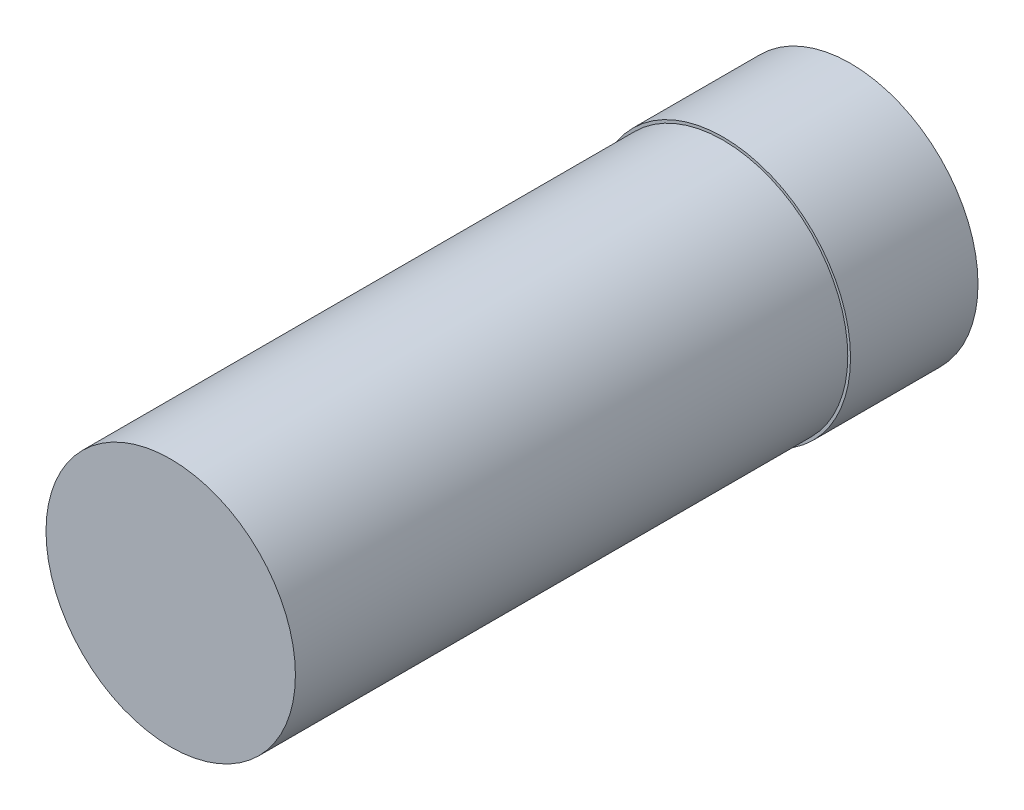
ISO-10303-21;
HEADER;
FILE_DESCRIPTION(('STEP AP214'),'2;1');
FILE_NAME('part.step','',(''),(''),'','','');
FILE_SCHEMA(('AUTOMOTIVE_DESIGN { 1 0 10303 214 1 1 1 1 }'));
ENDSEC;
DATA;
#1=APPLICATION_CONTEXT('core data for automotive mechanical design processes');
#2=APPLICATION_PROTOCOL_DEFINITION('international standard','automotive_design',2000,#1);
#3=PRODUCT_CONTEXT('',#1,'mechanical');
#4=PRODUCT('Part','Part','',(#3));
#5=PRODUCT_RELATED_PRODUCT_CATEGORY('part','',(#4));
#6=PRODUCT_DEFINITION_FORMATION('','',#4);
#7=PRODUCT_DEFINITION_CONTEXT('part definition',#1,'design');
#8=PRODUCT_DEFINITION('design','',#6,#7);
#9=PRODUCT_DEFINITION_SHAPE('','',#8);
#10=(LENGTH_UNIT() NAMED_UNIT(*) SI_UNIT(.MILLI.,.METRE.));
#11=(NAMED_UNIT(*) PLANE_ANGLE_UNIT() SI_UNIT($,.RADIAN.));
#12=(NAMED_UNIT(*) SI_UNIT($,.STERADIAN.) SOLID_ANGLE_UNIT());
#13=UNCERTAINTY_MEASURE_WITH_UNIT(LENGTH_MEASURE(1.E-05),#10,'distance_accuracy_value','');
#14=(GEOMETRIC_REPRESENTATION_CONTEXT(3) GLOBAL_UNCERTAINTY_ASSIGNED_CONTEXT((#13)) GLOBAL_UNIT_ASSIGNED_CONTEXT((#10,
#11,#12)) REPRESENTATION_CONTEXT('',''));
#15=CARTESIAN_POINT('',(0.,0.,0.));
#16=DIRECTION('',(0.,0.,1.));
#17=DIRECTION('',(1.,0.,0.));
#18=AXIS2_PLACEMENT_3D('',#15,#16,#17);
#19=CARTESIAN_POINT('',(0.,0.,3.));
#20=DIRECTION('',(0.,0.,-1.));
#21=DIRECTION('',(-1.,0.,0.));
#22=AXIS2_PLACEMENT_3D('',#19,#20,#21);
#23=CYLINDRICAL_SURFACE('',#22,3.);
#24=CARTESIAN_POINT('',(0.,0.,3.));
#25=DIRECTION('',(0.,0.,1.));
#26=DIRECTION('',(1.,0.,0.));
#27=AXIS2_PLACEMENT_3D('',#24,#25,#26);
#28=CIRCLE('',#27,3.);
#29=CARTESIAN_POINT('',(3.,0.,3.));
#30=VERTEX_POINT('',#29);
#31=EDGE_CURVE('E10',#30,#30,#28,.T.);
#32=ORIENTED_EDGE('',*,*,#31,.F.);
#33=EDGE_LOOP('',(#32));
#34=FACE_BOUND('',#33,.T.);
#35=CARTESIAN_POINT('',(0.,0.,0.));
#36=DIRECTION('',(0.,0.,1.));
#37=DIRECTION('',(1.,0.,0.));
#38=AXIS2_PLACEMENT_3D('',#35,#36,#37);
#39=CIRCLE('',#38,3.);
#40=CARTESIAN_POINT('',(3.,0.,0.));
#41=VERTEX_POINT('',#40);
#42=EDGE_CURVE('E33',#41,#41,#39,.T.);
#43=ORIENTED_EDGE('',*,*,#42,.T.);
#44=EDGE_LOOP('',(#43));
#45=FACE_BOUND('',#44,.T.);
#46=ADVANCED_FACE('F30',(#34,#45),#23,.T.);
#47=CARTESIAN_POINT('',(0.,0.,3.));
#48=DIRECTION('',(0.,0.,1.));
#49=DIRECTION('',(1.,0.,0.));
#50=AXIS2_PLACEMENT_3D('',#47,#48,#49);
#51=PLANE('',#50);
#52=CARTESIAN_POINT('',(0.,0.,3.));
#53=DIRECTION('',(0.,0.,1.));
#54=DIRECTION('',(1.,0.,0.));
#55=AXIS2_PLACEMENT_3D('',#52,#53,#54);
#56=CIRCLE('',#55,2.935);
#57=CARTESIAN_POINT('',(-2.935,0.,3.));
#58=VERTEX_POINT('',#57);
#59=EDGE_CURVE('E42',#58,#58,#56,.T.);
#60=ORIENTED_EDGE('',*,*,#59,.F.);
#61=EDGE_LOOP('',(#60));
#62=FACE_BOUND('',#61,.T.);
#63=ORIENTED_EDGE('',*,*,#31,.T.);
#64=EDGE_LOOP('',(#63));
#65=FACE_BOUND('',#64,.T.);
#66=ADVANCED_FACE('F57',(#62,#65),#51,.T.);
#67=CARTESIAN_POINT('',(0.,0.,0.));
#68=DIRECTION('',(0.,0.,1.));
#69=DIRECTION('',(1.,0.,0.));
#70=AXIS2_PLACEMENT_3D('',#67,#68,#69);
#71=PLANE('',#70);
#72=ORIENTED_EDGE('',*,*,#42,.F.);
#73=EDGE_LOOP('',(#72));
#74=FACE_BOUND('',#73,.T.);
#75=ADVANCED_FACE('F53',(#74),#71,.F.);
#76=CARTESIAN_POINT('',(0.,0.,16.));
#77=DIRECTION('',(0.,0.,-1.));
#78=DIRECTION('',(-1.,0.,0.));
#79=AXIS2_PLACEMENT_3D('',#76,#77,#78);
#80=CYLINDRICAL_SURFACE('',#79,2.935);
#81=CARTESIAN_POINT('',(0.,0.,16.));
#82=DIRECTION('',(0.,0.,1.));
#83=DIRECTION('',(1.,0.,0.));
#84=AXIS2_PLACEMENT_3D('',#81,#82,#83);
#85=CIRCLE('',#84,2.935);
#86=CARTESIAN_POINT('',(-2.935,0.,16.));
#87=VERTEX_POINT('',#86);
#88=EDGE_CURVE('E40',#87,#87,#85,.T.);
#89=CARTESIAN_POINT('',(-2.935,0.,16.));
#90=CARTESIAN_POINT('',(-2.935,0.,15.8645833333333));
#91=CARTESIAN_POINT('',(-2.935,0.,15.7291666666667));
#92=CARTESIAN_POINT('',(-2.935,0.,15.4583333333333));
#93=CARTESIAN_POINT('',(-2.935,0.,15.3229166666667));
#94=CARTESIAN_POINT('',(-2.935,0.,15.0520833333333));
#95=CARTESIAN_POINT('',(-2.935,0.,14.9166666666667));
#96=CARTESIAN_POINT('',(-2.935,0.,14.6458333333333));
#97=CARTESIAN_POINT('',(-2.935,0.,14.5104166666667));
#98=CARTESIAN_POINT('',(-2.935,0.,14.2395833333333));
#99=CARTESIAN_POINT('',(-2.935,0.,14.1041666666667));
#100=CARTESIAN_POINT('',(-2.935,0.,13.8333333333333));
#101=CARTESIAN_POINT('',(-2.935,0.,13.6979166666667));
#102=CARTESIAN_POINT('',(-2.935,0.,13.4270833333333));
#103=CARTESIAN_POINT('',(-2.935,0.,13.2916666666667));
#104=CARTESIAN_POINT('',(-2.935,0.,13.0208333333333));
#105=CARTESIAN_POINT('',(-2.935,0.,12.8854166666667));
#106=CARTESIAN_POINT('',(-2.935,0.,12.6145833333333));
#107=CARTESIAN_POINT('',(-2.935,0.,12.4791666666667));
#108=CARTESIAN_POINT('',(-2.935,0.,12.2083333333333));
#109=CARTESIAN_POINT('',(-2.935,0.,12.0729166666667));
#110=CARTESIAN_POINT('',(-2.935,0.,11.8020833333333));
#111=CARTESIAN_POINT('',(-2.935,0.,11.6666666666667));
#112=CARTESIAN_POINT('',(-2.935,0.,11.3958333333333));
#113=CARTESIAN_POINT('',(-2.935,0.,11.2604166666667));
#114=CARTESIAN_POINT('',(-2.935,0.,10.9895833333333));
#115=CARTESIAN_POINT('',(-2.935,0.,10.8541666666667));
#116=CARTESIAN_POINT('',(-2.935,0.,10.5833333333333));
#117=CARTESIAN_POINT('',(-2.935,0.,10.4479166666667));
#118=CARTESIAN_POINT('',(-2.935,0.,10.1770833333333));
#119=CARTESIAN_POINT('',(-2.935,0.,10.0416666666667));
#120=CARTESIAN_POINT('',(-2.935,0.,9.77083333333333));
#121=CARTESIAN_POINT('',(-2.935,0.,9.63541666666667));
#122=CARTESIAN_POINT('',(-2.935,0.,9.36458333333333));
#123=CARTESIAN_POINT('',(-2.935,0.,9.22916666666667));
#124=CARTESIAN_POINT('',(-2.935,0.,8.95833333333333));
#125=CARTESIAN_POINT('',(-2.935,0.,8.82291666666667));
#126=CARTESIAN_POINT('',(-2.935,0.,8.55208333333333));
#127=CARTESIAN_POINT('',(-2.935,0.,8.41666666666667));
#128=CARTESIAN_POINT('',(-2.935,0.,8.14583333333333));
#129=CARTESIAN_POINT('',(-2.935,0.,8.01041666666667));
#130=CARTESIAN_POINT('',(-2.935,0.,7.73958333333333));
#131=CARTESIAN_POINT('',(-2.935,0.,7.60416666666667));
#132=CARTESIAN_POINT('',(-2.935,0.,7.33333333333333));
#133=CARTESIAN_POINT('',(-2.935,0.,7.19791666666667));
#134=CARTESIAN_POINT('',(-2.935,0.,6.92708333333333));
#135=CARTESIAN_POINT('',(-2.935,0.,6.79166666666667));
#136=CARTESIAN_POINT('',(-2.935,0.,6.52083333333333));
#137=CARTESIAN_POINT('',(-2.935,0.,6.38541666666667));
#138=CARTESIAN_POINT('',(-2.935,0.,6.11458333333333));
#139=CARTESIAN_POINT('',(-2.935,0.,5.97916666666667));
#140=CARTESIAN_POINT('',(-2.935,0.,5.70833333333333));
#141=CARTESIAN_POINT('',(-2.935,0.,5.57291666666667));
#142=CARTESIAN_POINT('',(-2.935,0.,5.30208333333333));
#143=CARTESIAN_POINT('',(-2.935,0.,5.16666666666667));
#144=CARTESIAN_POINT('',(-2.935,0.,4.89583333333333));
#145=CARTESIAN_POINT('',(-2.935,0.,4.76041666666667));
#146=CARTESIAN_POINT('',(-2.935,0.,4.48958333333333));
#147=CARTESIAN_POINT('',(-2.935,0.,4.35416666666667));
#148=CARTESIAN_POINT('',(-2.935,0.,4.08333333333333));
#149=CARTESIAN_POINT('',(-2.935,0.,3.94791666666667));
#150=CARTESIAN_POINT('',(-2.935,0.,3.67708333333333));
#151=CARTESIAN_POINT('',(-2.935,0.,3.54166666666667));
#152=CARTESIAN_POINT('',(-2.935,0.,3.27083333333333));
#153=CARTESIAN_POINT('',(-2.935,0.,3.13541666666667));
#154=CARTESIAN_POINT('',(-2.935,0.,3.));
#155=B_SPLINE_CURVE_WITH_KNOTS('',3,(#89,#90,#91,#92,#93,#94,#95,#96,#97,#98,#99,#100,#101,#102,
#103,#104,#105,#106,#107,#108,#109,#110,#111,#112,#113,#114,#115,#116,#117,#118,#119,#120,#121,
#122,#123,#124,#125,#126,#127,#128,#129,#130,#131,#132,#133,#134,#135,#136,#137,#138,#139,#140,
#141,#142,#143,#144,#145,#146,#147,#148,#149,#150,#151,#152,#153,#154),.UNSPECIFIED.,.F.,.F.,(4,
2,2,2,2,2,2,2,2,2,2,2,2,2,2,2,2,2,2,2,2,2,2,2,2,2,2,2,2,2,2,2,4),(0.,0.406250000000002,
0.812500000000001,1.21875,1.625,2.03125,2.4375,2.84375,3.25,3.65625,4.0625,4.46875,4.875,
5.28125,5.6875,6.09375,6.5,6.90625,7.3125,7.71875,8.125,8.53125,8.9375,9.34375,9.75,10.15625,
10.5625,10.96875,11.375,11.78125,12.1875,12.59375,13.),.UNSPECIFIED.);
#156=EDGE_CURVE('BSEAM50',#87,#58,#155,.T.);
#157=ORIENTED_EDGE('',*,*,#88,.F.);
#158=ORIENTED_EDGE('',*,*,#59,.T.);
#159=ORIENTED_EDGE('',*,*,#156,.T.);
#160=ORIENTED_EDGE('',*,*,#156,.F.);
#161=EDGE_LOOP('',(#157,#159,#158,#160));
#162=FACE_BOUND('',#161,.T.);
#163=ADVANCED_FACE('F50',(#162),#80,.T.);
#164=CARTESIAN_POINT('',(0.,0.,16.));
#165=DIRECTION('',(0.,0.,1.));
#166=DIRECTION('',(1.,0.,0.));
#167=AXIS2_PLACEMENT_3D('',#164,#165,#166);
#168=PLANE('',#167);
#169=ORIENTED_EDGE('',*,*,#88,.T.);
#170=EDGE_LOOP('',(#169));
#171=FACE_BOUND('',#170,.T.);
#172=ADVANCED_FACE('F48',(#171),#168,.T.);
#173=CLOSED_SHELL('',(#46,#66,#75,#163,#172));
#174=MANIFOLD_SOLID_BREP('B2',#173);
#175=ADVANCED_BREP_SHAPE_REPRESENTATION('',(#18,#174),#14);
#176=SHAPE_DEFINITION_REPRESENTATION(#9,#175);
ENDSEC;
END-ISO-10303-21;
